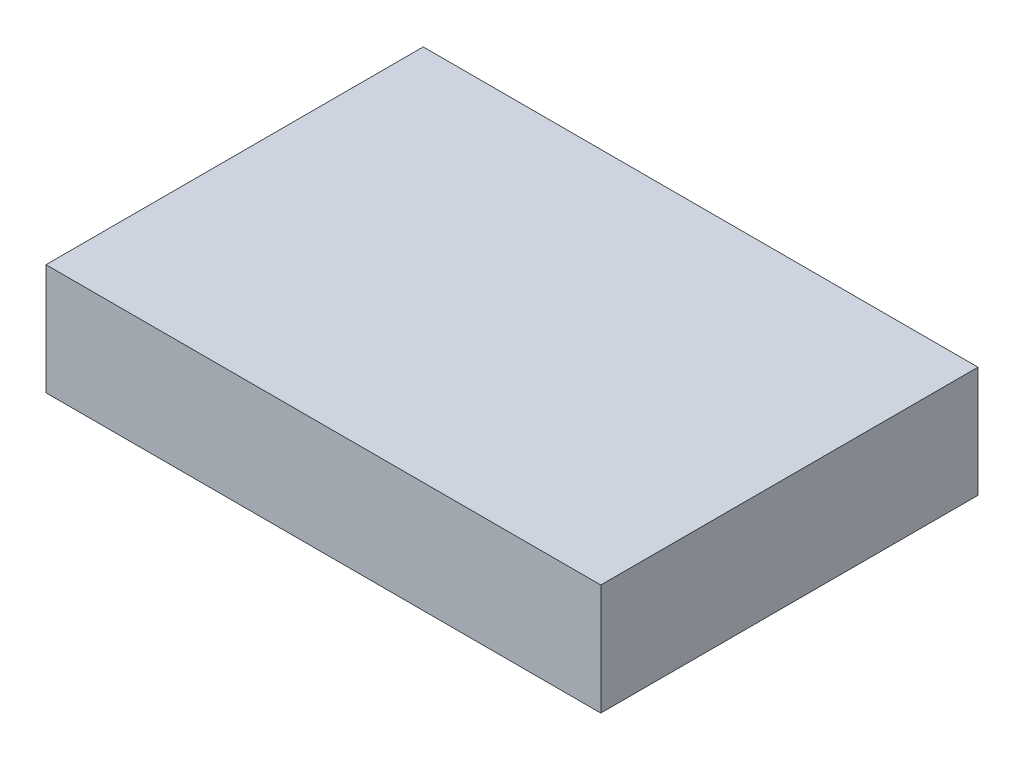
ISO-10303-21;
HEADER;
FILE_DESCRIPTION(('STEP AP214'),'2;1');
FILE_NAME('part.step','',(''),(''),'','','');
FILE_SCHEMA(('AUTOMOTIVE_DESIGN { 1 0 10303 214 1 1 1 1 }'));
ENDSEC;
DATA;
#1=APPLICATION_CONTEXT('core data for automotive mechanical design processes');
#2=APPLICATION_PROTOCOL_DEFINITION('international standard','automotive_design',2000,#1);
#3=PRODUCT_CONTEXT('',#1,'mechanical');
#4=PRODUCT('Part','Part','',(#3));
#5=PRODUCT_RELATED_PRODUCT_CATEGORY('part','',(#4));
#6=PRODUCT_DEFINITION_FORMATION('','',#4);
#7=PRODUCT_DEFINITION_CONTEXT('part definition',#1,'design');
#8=PRODUCT_DEFINITION('design','',#6,#7);
#9=PRODUCT_DEFINITION_SHAPE('','',#8);
#10=(LENGTH_UNIT() NAMED_UNIT(*) SI_UNIT(.MILLI.,.METRE.));
#11=(NAMED_UNIT(*) PLANE_ANGLE_UNIT() SI_UNIT($,.RADIAN.));
#12=(NAMED_UNIT(*) SI_UNIT($,.STERADIAN.) SOLID_ANGLE_UNIT());
#13=UNCERTAINTY_MEASURE_WITH_UNIT(LENGTH_MEASURE(1.E-05),#10,'distance_accuracy_value','');
#14=(GEOMETRIC_REPRESENTATION_CONTEXT(3) GLOBAL_UNCERTAINTY_ASSIGNED_CONTEXT((#13)) GLOBAL_UNIT_ASSIGNED_CONTEXT((#10,
#11,#12)) REPRESENTATION_CONTEXT('',''));
#15=CARTESIAN_POINT('',(0.,0.,0.));
#16=DIRECTION('',(0.,0.,1.));
#17=DIRECTION('',(1.,0.,0.));
#18=AXIS2_PLACEMENT_3D('',#15,#16,#17);
#19=CARTESIAN_POINT('',(25.,10.,-17.));
#20=DIRECTION('',(-1.,0.,0.));
#21=DIRECTION('',(0.,0.,1.));
#22=AXIS2_PLACEMENT_3D('',#19,#20,#21);
#23=PLANE('',#22);
#24=DIRECTION('',(0.,0.,-1.));
#25=VECTOR('',#24,1.);
#26=CARTESIAN_POINT('',(25.,0.,-17.));
#27=LINE('',#26,#25);
#28=CARTESIAN_POINT('',(25.,0.,17.));
#29=VERTEX_POINT('',#28);
#30=CARTESIAN_POINT('',(25.,0.,-17.));
#31=VERTEX_POINT('',#30);
#32=EDGE_CURVE('E96',#29,#31,#27,.T.);
#33=ORIENTED_EDGE('',*,*,#32,.T.);
#34=DIRECTION('',(0.,-1.,0.));
#35=VECTOR('',#34,1.);
#36=CARTESIAN_POINT('',(25.,10.,-17.));
#37=LINE('',#36,#35);
#38=CARTESIAN_POINT('',(25.,10.,-17.));
#39=VERTEX_POINT('',#38);
#40=EDGE_CURVE('E11',#39,#31,#37,.T.);
#41=ORIENTED_EDGE('',*,*,#40,.F.);
#42=DIRECTION('',(0.,0.,-1.));
#43=VECTOR('',#42,1.);
#44=CARTESIAN_POINT('',(25.,10.,-17.));
#45=LINE('',#44,#43);
#46=CARTESIAN_POINT('',(25.,10.,17.));
#47=VERTEX_POINT('',#46);
#48=EDGE_CURVE('E84',#47,#39,#45,.T.);
#49=ORIENTED_EDGE('',*,*,#48,.F.);
#50=DIRECTION('',(0.,-1.,0.));
#51=VECTOR('',#50,1.);
#52=CARTESIAN_POINT('',(25.,10.,17.));
#53=LINE('',#52,#51);
#54=EDGE_CURVE('E92',#47,#29,#53,.T.);
#55=ORIENTED_EDGE('',*,*,#54,.T.);
#56=EDGE_LOOP('',(#33,#41,#49,#55));
#57=FACE_BOUND('',#56,.T.);
#58=ADVANCED_FACE('F33',(#57),#23,.F.);
#59=CARTESIAN_POINT('',(-25.,10.,-17.));
#60=DIRECTION('',(0.,0.,1.));
#61=DIRECTION('',(1.,0.,0.));
#62=AXIS2_PLACEMENT_3D('',#59,#60,#61);
#63=PLANE('',#62);
#64=DIRECTION('',(-1.,0.,0.));
#65=VECTOR('',#64,1.);
#66=CARTESIAN_POINT('',(-25.,0.,-17.));
#67=LINE('',#66,#65);
#68=CARTESIAN_POINT('',(-25.,0.,-17.));
#69=VERTEX_POINT('',#68);
#70=EDGE_CURVE('E88',#31,#69,#67,.T.);
#71=ORIENTED_EDGE('',*,*,#70,.T.);
#72=DIRECTION('',(0.,-1.,0.));
#73=VECTOR('',#72,1.);
#74=CARTESIAN_POINT('',(-25.,10.,-17.));
#75=LINE('',#74,#73);
#76=CARTESIAN_POINT('',(-25.,10.,-17.));
#77=VERTEX_POINT('',#76);
#78=EDGE_CURVE('E41',#77,#69,#75,.T.);
#79=ORIENTED_EDGE('',*,*,#78,.F.);
#80=DIRECTION('',(-1.,0.,0.));
#81=VECTOR('',#80,1.);
#82=CARTESIAN_POINT('',(-25.,10.,-17.));
#83=LINE('',#82,#81);
#84=EDGE_CURVE('E79',#39,#77,#83,.T.);
#85=ORIENTED_EDGE('',*,*,#84,.F.);
#86=ORIENTED_EDGE('',*,*,#40,.T.);
#87=EDGE_LOOP('',(#71,#79,#85,#86));
#88=FACE_BOUND('',#87,.T.);
#89=ADVANCED_FACE('F87',(#88),#63,.F.);
#90=CARTESIAN_POINT('',(-25.,10.,-17.));
#91=DIRECTION('',(1.,0.,0.));
#92=DIRECTION('',(0.,0.,-1.));
#93=AXIS2_PLACEMENT_3D('',#90,#91,#92);
#94=PLANE('',#93);
#95=DIRECTION('',(0.,0.,1.));
#96=VECTOR('',#95,1.);
#97=CARTESIAN_POINT('',(-25.,0.,-17.));
#98=LINE('',#97,#96);
#99=CARTESIAN_POINT('',(-25.,0.,17.));
#100=VERTEX_POINT('',#99);
#101=EDGE_CURVE('E66',#69,#100,#98,.T.);
#102=ORIENTED_EDGE('',*,*,#101,.T.);
#103=DIRECTION('',(0.,-1.,0.));
#104=VECTOR('',#103,1.);
#105=CARTESIAN_POINT('',(-25.,10.,17.));
#106=LINE('',#105,#104);
#107=CARTESIAN_POINT('',(-25.,10.,17.));
#108=VERTEX_POINT('',#107);
#109=EDGE_CURVE('E89',#108,#100,#106,.T.);
#110=ORIENTED_EDGE('',*,*,#109,.F.);
#111=DIRECTION('',(0.,0.,1.));
#112=VECTOR('',#111,1.);
#113=CARTESIAN_POINT('',(-25.,10.,-17.));
#114=LINE('',#113,#112);
#115=EDGE_CURVE('E82',#77,#108,#114,.T.);
#116=ORIENTED_EDGE('',*,*,#115,.F.);
#117=ORIENTED_EDGE('',*,*,#78,.T.);
#118=EDGE_LOOP('',(#102,#110,#116,#117));
#119=FACE_BOUND('',#118,.T.);
#120=ADVANCED_FACE('F90',(#119),#94,.F.);
#121=CARTESIAN_POINT('',(-25.,10.,17.));
#122=DIRECTION('',(0.,0.,-1.));
#123=DIRECTION('',(-1.,0.,0.));
#124=AXIS2_PLACEMENT_3D('',#121,#122,#123);
#125=PLANE('',#124);
#126=DIRECTION('',(1.,0.,0.));
#127=VECTOR('',#126,1.);
#128=CARTESIAN_POINT('',(-25.,0.,17.));
#129=LINE('',#128,#127);
#130=EDGE_CURVE('E72',#100,#29,#129,.T.);
#131=ORIENTED_EDGE('',*,*,#130,.T.);
#132=ORIENTED_EDGE('',*,*,#54,.F.);
#133=DIRECTION('',(1.,0.,0.));
#134=VECTOR('',#133,1.);
#135=CARTESIAN_POINT('',(-25.,10.,17.));
#136=LINE('',#135,#134);
#137=EDGE_CURVE('E49',#108,#47,#136,.T.);
#138=ORIENTED_EDGE('',*,*,#137,.F.);
#139=ORIENTED_EDGE('',*,*,#109,.T.);
#140=EDGE_LOOP('',(#131,#132,#138,#139));
#141=FACE_BOUND('',#140,.T.);
#142=ADVANCED_FACE('F103',(#141),#125,.F.);
#143=CARTESIAN_POINT('',(0.,10.,0.));
#144=DIRECTION('',(0.,1.,0.));
#145=DIRECTION('',(0.,0.,1.));
#146=AXIS2_PLACEMENT_3D('',#143,#144,#145);
#147=PLANE('',#146);
#148=ORIENTED_EDGE('',*,*,#48,.T.);
#149=ORIENTED_EDGE('',*,*,#84,.T.);
#150=ORIENTED_EDGE('',*,*,#115,.T.);
#151=ORIENTED_EDGE('',*,*,#137,.T.);
#152=EDGE_LOOP('',(#148,#149,#150,#151));
#153=FACE_BOUND('',#152,.T.);
#154=ADVANCED_FACE('F80',(#153),#147,.T.);
#155=CARTESIAN_POINT('',(0.,0.,0.));
#156=DIRECTION('',(0.,1.,0.));
#157=DIRECTION('',(0.,0.,1.));
#158=AXIS2_PLACEMENT_3D('',#155,#156,#157);
#159=PLANE('',#158);
#160=ORIENTED_EDGE('',*,*,#32,.F.);
#161=ORIENTED_EDGE('',*,*,#130,.F.);
#162=ORIENTED_EDGE('',*,*,#101,.F.);
#163=ORIENTED_EDGE('',*,*,#70,.F.);
#164=EDGE_LOOP('',(#160,#161,#162,#163));
#165=FACE_BOUND('',#164,.T.);
#166=ADVANCED_FACE('F106',(#165),#159,.F.);
#167=CLOSED_SHELL('',(#58,#89,#120,#142,#154,#166));
#168=MANIFOLD_SOLID_BREP('B2',#167);
#169=ADVANCED_BREP_SHAPE_REPRESENTATION('',(#18,#168),#14);
#170=SHAPE_DEFINITION_REPRESENTATION(#9,#169);
ENDSEC;
END-ISO-10303-21;
